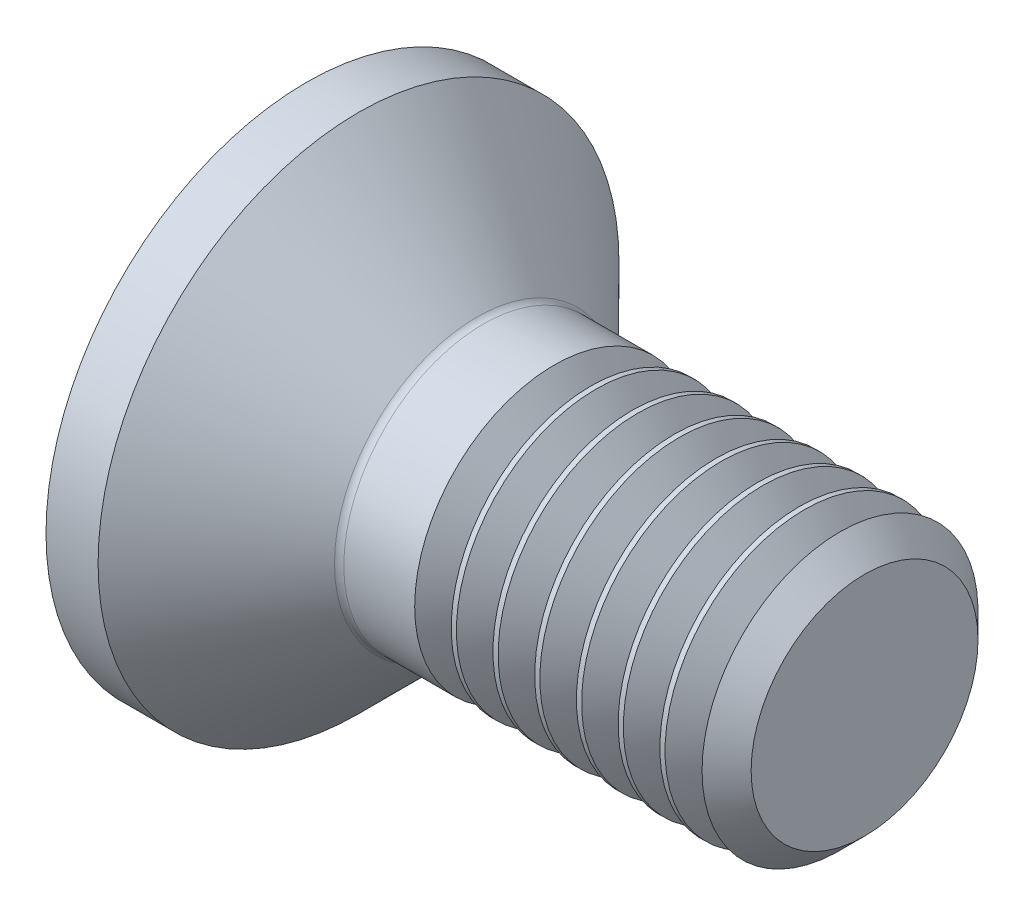
ISO-10303-21;
HEADER;
FILE_DESCRIPTION(('STEP AP214'),'2;1');
FILE_NAME('part.step','',(''),(''),'','','');
FILE_SCHEMA(('AUTOMOTIVE_DESIGN { 1 0 10303 214 1 1 1 1 }'));
ENDSEC;
DATA;
#1=APPLICATION_CONTEXT('core data for automotive mechanical design processes');
#2=APPLICATION_PROTOCOL_DEFINITION('international standard','automotive_design',2000,#1);
#3=PRODUCT_CONTEXT('',#1,'mechanical');
#4=PRODUCT('Part','Part','',(#3));
#5=PRODUCT_RELATED_PRODUCT_CATEGORY('part','',(#4));
#6=PRODUCT_DEFINITION_FORMATION('','',#4);
#7=PRODUCT_DEFINITION_CONTEXT('part definition',#1,'design');
#8=PRODUCT_DEFINITION('design','',#6,#7);
#9=PRODUCT_DEFINITION_SHAPE('','',#8);
#10=(LENGTH_UNIT() NAMED_UNIT(*) SI_UNIT(.MILLI.,.METRE.));
#11=(NAMED_UNIT(*) PLANE_ANGLE_UNIT() SI_UNIT($,.RADIAN.));
#12=(NAMED_UNIT(*) SI_UNIT($,.STERADIAN.) SOLID_ANGLE_UNIT());
#13=UNCERTAINTY_MEASURE_WITH_UNIT(LENGTH_MEASURE(1.E-05),#10,'distance_accuracy_value','');
#14=(GEOMETRIC_REPRESENTATION_CONTEXT(3) GLOBAL_UNCERTAINTY_ASSIGNED_CONTEXT((#13)) GLOBAL_UNIT_ASSIGNED_CONTEXT((#10,
#11,#12)) REPRESENTATION_CONTEXT('',''));
#15=CARTESIAN_POINT('',(0.,0.,0.));
#16=DIRECTION('',(0.,0.,1.));
#17=DIRECTION('',(1.,0.,0.));
#18=AXIS2_PLACEMENT_3D('',#15,#16,#17);
#19=CARTESIAN_POINT('',(0.,0.,0.));
#20=DIRECTION('',(-1.,0.,0.));
#21=DIRECTION('',(0.,0.,1.));
#22=AXIS2_PLACEMENT_3D('',#19,#20,#21);
#23=PLANE('',#22);
#24=CARTESIAN_POINT('',(0.,0.,0.));
#25=DIRECTION('',(-1.,0.,0.));
#26=DIRECTION('',(0.,0.,1.));
#27=AXIS2_PLACEMENT_3D('',#24,#25,#26);
#28=CIRCLE('',#27,2.8);
#29=CARTESIAN_POINT('',(0.,0.,2.8));
#30=VERTEX_POINT('',#29);
#31=EDGE_CURVE('E150',#30,#30,#28,.T.);
#32=ORIENTED_EDGE('',*,*,#31,.T.);
#33=EDGE_LOOP('',(#32));
#34=FACE_BOUND('',#33,.T.);
#35=DIRECTION('',(0.,-0.499999999999998,-0.86602540378444));
#36=VECTOR('',#35,1.);
#37=CARTESIAN_POINT('',(0.,-0.577350269189626,1.));
#38=LINE('',#37,#36);
#39=CARTESIAN_POINT('',(0.,-0.577350269189626,1.));
#40=VERTEX_POINT('',#39);
#41=CARTESIAN_POINT('',(0.,-1.15470053837925,0.));
#42=VERTEX_POINT('',#41);
#43=EDGE_CURVE('E119',#40,#42,#38,.T.);
#44=ORIENTED_EDGE('',*,*,#43,.T.);
#45=DIRECTION('',(0.,0.499999999999999,-0.866025403784439));
#46=VECTOR('',#45,1.);
#47=CARTESIAN_POINT('',(0.,-1.15470053837925,0.));
#48=LINE('',#47,#46);
#49=CARTESIAN_POINT('',(0.,-0.577350269189625,-1.));
#50=VERTEX_POINT('',#49);
#51=EDGE_CURVE('E50',#42,#50,#48,.T.);
#52=ORIENTED_EDGE('',*,*,#51,.T.);
#53=DIRECTION('',(0.,1.,0.));
#54=VECTOR('',#53,1.);
#55=CARTESIAN_POINT('',(0.,-0.577350269189625,-1.));
#56=LINE('',#55,#54);
#57=CARTESIAN_POINT('',(0.,0.577350269189626,-1.));
#58=VERTEX_POINT('',#57);
#59=EDGE_CURVE('E130',#50,#58,#56,.T.);
#60=ORIENTED_EDGE('',*,*,#59,.T.);
#61=DIRECTION('',(0.,0.5,0.866025403784439));
#62=VECTOR('',#61,1.);
#63=CARTESIAN_POINT('',(0.,0.577350269189626,-1.));
#64=LINE('',#63,#62);
#65=CARTESIAN_POINT('',(0.,1.15470053837925,0.));
#66=VERTEX_POINT('',#65);
#67=EDGE_CURVE('E361',#58,#66,#64,.T.);
#68=ORIENTED_EDGE('',*,*,#67,.T.);
#69=DIRECTION('',(0.,-0.499999999999999,0.866025403784439));
#70=VECTOR('',#69,1.);
#71=CARTESIAN_POINT('',(0.,1.15470053837925,0.));
#72=LINE('',#71,#70);
#73=CARTESIAN_POINT('',(0.,0.577350269189625,0.999999999999999));
#74=VERTEX_POINT('',#73);
#75=EDGE_CURVE('E364',#66,#74,#72,.T.);
#76=ORIENTED_EDGE('',*,*,#75,.T.);
#77=DIRECTION('',(0.,-1.,0.));
#78=VECTOR('',#77,1.);
#79=CARTESIAN_POINT('',(0.,0.577350269189625,0.999999999999999));
#80=LINE('',#79,#78);
#81=EDGE_CURVE('E367',#74,#40,#80,.T.);
#82=ORIENTED_EDGE('',*,*,#81,.T.);
#83=EDGE_LOOP('',(#44,#52,#60,#68,#76,#82));
#84=FACE_BOUND('',#83,.T.);
#85=ADVANCED_FACE('F34',(#34,#84),#23,.T.);
#86=CARTESIAN_POINT('',(0.,0.,0.));
#87=DIRECTION('',(-1.,0.,0.));
#88=DIRECTION('',(0.,0.,1.));
#89=AXIS2_PLACEMENT_3D('',#86,#87,#88);
#90=CYLINDRICAL_SURFACE('',#89,2.8);
#91=CARTESIAN_POINT('',(0.560000000000009,0.,0.));
#92=DIRECTION('',(-1.,0.,0.));
#93=DIRECTION('',(0.,0.,1.));
#94=AXIS2_PLACEMENT_3D('',#91,#92,#93);
#95=CIRCLE('',#94,2.8);
#96=CARTESIAN_POINT('',(0.560000000000009,0.,2.8));
#97=VERTEX_POINT('',#96);
#98=EDGE_CURVE('E147',#97,#97,#95,.T.);
#99=ORIENTED_EDGE('',*,*,#98,.T.);
#100=EDGE_LOOP('',(#99));
#101=FACE_BOUND('',#100,.T.);
#102=ORIENTED_EDGE('',*,*,#31,.F.);
#103=EDGE_LOOP('',(#102));
#104=FACE_BOUND('',#103,.T.);
#105=ADVANCED_FACE('F173',(#101,#104),#90,.T.);
#106=CARTESIAN_POINT('',(0.560000000000009,0.,0.));
#107=DIRECTION('',(-1.,0.,0.));
#108=DIRECTION('',(0.,0.,1.));
#109=AXIS2_PLACEMENT_3D('',#106,#107,#108);
#110=CONICAL_SURFACE('',#109,2.8,0.785398163397449);
#111=CARTESIAN_POINT('',(1.83071067811866,0.,0.));
#112=DIRECTION('',(-1.,0.,0.));
#113=DIRECTION('',(0.,0.,1.));
#114=AXIS2_PLACEMENT_3D('',#111,#112,#113);
#115=CIRCLE('',#114,1.52928932188135);
#116=CARTESIAN_POINT('',(1.83071067811866,0.,1.52928932188135));
#117=VERTEX_POINT('',#116);
#118=EDGE_CURVE('E43',#117,#117,#115,.T.);
#119=ORIENTED_EDGE('',*,*,#118,.T.);
#120=EDGE_LOOP('',(#119));
#121=FACE_BOUND('',#120,.T.);
#122=ORIENTED_EDGE('',*,*,#98,.F.);
#123=EDGE_LOOP('',(#122));
#124=FACE_BOUND('',#123,.T.);
#125=ADVANCED_FACE('F156',(#121,#124),#110,.T.);
#126=CARTESIAN_POINT('',(0.,0.,0.));
#127=DIRECTION('',(-1.,0.,0.));
#128=DIRECTION('',(0.,0.,1.));
#129=AXIS2_PLACEMENT_3D('',#126,#127,#128);
#130=CYLINDRICAL_SURFACE('',#129,1.5);
#131=CARTESIAN_POINT('',(2.66359278553218,0.,0.));
#132=DIRECTION('',(-1.,0.,0.));
#133=DIRECTION('',(0.,-1.,0.));
#134=AXIS2_PLACEMENT_3D('',#131,#132,#133);
#135=CIRCLE('',#134,1.5);
#136=CARTESIAN_POINT('',(2.66359278553218,-1.5,0.));
#137=VERTEX_POINT('',#136);
#138=EDGE_CURVE('E337',#137,#137,#135,.T.);
#139=ORIENTED_EDGE('',*,*,#138,.T.);
#140=EDGE_LOOP('',(#139));
#141=FACE_BOUND('',#140,.T.);
#142=CARTESIAN_POINT('',(1.90142135623731,0.,0.));
#143=DIRECTION('',(-1.,0.,0.));
#144=DIRECTION('',(0.,0.,1.));
#145=AXIS2_PLACEMENT_3D('',#142,#143,#144);
#146=CIRCLE('',#145,1.5);
#147=CARTESIAN_POINT('',(1.90142135623731,0.,1.5));
#148=VERTEX_POINT('',#147);
#149=EDGE_CURVE('E11',#148,#148,#146,.F.);
#150=ORIENTED_EDGE('',*,*,#149,.T.);
#151=EDGE_LOOP('',(#150));
#152=FACE_BOUND('',#151,.T.);
#153=ADVANCED_FACE('F160',(#141,#152),#130,.T.);
#154=CARTESIAN_POINT('',(1.90142135623731,0.,0.));
#155=DIRECTION('',(-1.,0.,0.));
#156=DIRECTION('',(0.,0.,1.));
#157=AXIS2_PLACEMENT_3D('',#154,#155,#156);
#158=TOROIDAL_SURFACE('',#157,1.6,0.1);
#159=ORIENTED_EDGE('',*,*,#149,.F.);
#160=EDGE_LOOP('',(#159));
#161=FACE_BOUND('',#160,.T.);
#162=ORIENTED_EDGE('',*,*,#118,.F.);
#163=EDGE_LOOP('',(#162));
#164=FACE_BOUND('',#163,.T.);
#165=ADVANCED_FACE('F36',(#161,#164),#158,.F.);
#166=CARTESIAN_POINT('',(1.1,-1.15470053837925,0.));
#167=DIRECTION('',(0.,0.866025403784439,0.499999999999999));
#168=DIRECTION('',(0.,-0.499999999999999,0.866025403784439));
#169=AXIS2_PLACEMENT_3D('',#166,#167,#168);
#170=PLANE('',#169);
#171=ORIENTED_EDGE('',*,*,#51,.F.);
#172=DIRECTION('',(-1.,0.,0.));
#173=VECTOR('',#172,1.);
#174=CARTESIAN_POINT('',(1.1,-1.15470053837925,0.));
#175=LINE('',#174,#173);
#176=CARTESIAN_POINT('',(1.1,-1.15470053837925,0.));
#177=VERTEX_POINT('',#176);
#178=EDGE_CURVE('E358',#177,#42,#175,.T.);
#179=ORIENTED_EDGE('',*,*,#178,.F.);
#180=DIRECTION('',(0.,0.499999999999999,-0.866025403784439));
#181=VECTOR('',#180,1.);
#182=CARTESIAN_POINT('',(1.1,-1.15470053837925,0.));
#183=LINE('',#182,#181);
#184=CARTESIAN_POINT('',(1.1,-0.866025403784438,-0.499999999999998));
#185=VERTEX_POINT('',#184);
#186=EDGE_CURVE('E115',#177,#185,#183,.T.);
#187=ORIENTED_EDGE('',*,*,#186,.T.);
#188=CARTESIAN_POINT('',(1.1,-0.577350269189625,-1.));
#189=VERTEX_POINT('',#188);
#190=EDGE_CURVE('E111',#185,#189,#183,.T.);
#191=ORIENTED_EDGE('',*,*,#190,.T.);
#192=DIRECTION('',(-1.,0.,0.));
#193=VECTOR('',#192,1.);
#194=CARTESIAN_POINT('',(1.1,-0.577350269189625,-1.));
#195=LINE('',#194,#193);
#196=EDGE_CURVE('E113',#189,#50,#195,.T.);
#197=ORIENTED_EDGE('',*,*,#196,.T.);
#198=EDGE_LOOP('',(#171,#179,#187,#191,#197));
#199=FACE_BOUND('',#198,.T.);
#200=ADVANCED_FACE('F112',(#199),#170,.T.);
#201=CARTESIAN_POINT('',(1.1,-0.577350269189625,-1.));
#202=DIRECTION('',(0.,0.,1.));
#203=DIRECTION('',(1.,0.,0.));
#204=AXIS2_PLACEMENT_3D('',#201,#202,#203);
#205=PLANE('',#204);
#206=ORIENTED_EDGE('',*,*,#59,.F.);
#207=ORIENTED_EDGE('',*,*,#196,.F.);
#208=DIRECTION('',(0.,1.,0.));
#209=VECTOR('',#208,1.);
#210=CARTESIAN_POINT('',(1.1,-0.577350269189625,-1.));
#211=LINE('',#210,#209);
#212=CARTESIAN_POINT('',(1.1,0.,-1.));
#213=VERTEX_POINT('',#212);
#214=EDGE_CURVE('E58',#189,#213,#211,.T.);
#215=ORIENTED_EDGE('',*,*,#214,.T.);
#216=CARTESIAN_POINT('',(1.1,0.577350269189626,-1.));
#217=VERTEX_POINT('',#216);
#218=EDGE_CURVE('E125',#213,#217,#211,.T.);
#219=ORIENTED_EDGE('',*,*,#218,.T.);
#220=DIRECTION('',(-1.,0.,0.));
#221=VECTOR('',#220,1.);
#222=CARTESIAN_POINT('',(1.1,0.577350269189626,-1.));
#223=LINE('',#222,#221);
#224=EDGE_CURVE('E132',#217,#58,#223,.T.);
#225=ORIENTED_EDGE('',*,*,#224,.T.);
#226=EDGE_LOOP('',(#206,#207,#215,#219,#225));
#227=FACE_BOUND('',#226,.T.);
#228=ADVANCED_FACE('F127',(#227),#205,.T.);
#229=CARTESIAN_POINT('',(1.1,0.577350269189626,-1.));
#230=DIRECTION('',(0.,-0.866025403784438,0.5));
#231=DIRECTION('',(0.,-0.5,-0.866025403784439));
#232=AXIS2_PLACEMENT_3D('',#229,#230,#231);
#233=PLANE('',#232);
#234=ORIENTED_EDGE('',*,*,#67,.F.);
#235=ORIENTED_EDGE('',*,*,#224,.F.);
#236=DIRECTION('',(0.,0.5,0.866025403784439));
#237=VECTOR('',#236,1.);
#238=CARTESIAN_POINT('',(1.1,0.577350269189626,-1.));
#239=LINE('',#238,#237);
#240=CARTESIAN_POINT('',(1.1,0.866025403784439,-0.5));
#241=VERTEX_POINT('',#240);
#242=EDGE_CURVE('E343',#217,#241,#239,.T.);
#243=ORIENTED_EDGE('',*,*,#242,.T.);
#244=CARTESIAN_POINT('',(1.1,1.15470053837925,0.));
#245=VERTEX_POINT('',#244);
#246=EDGE_CURVE('E124',#241,#245,#239,.T.);
#247=ORIENTED_EDGE('',*,*,#246,.T.);
#248=DIRECTION('',(-1.,0.,0.));
#249=VECTOR('',#248,1.);
#250=CARTESIAN_POINT('',(1.1,1.15470053837925,0.));
#251=LINE('',#250,#249);
#252=EDGE_CURVE('E138',#245,#66,#251,.T.);
#253=ORIENTED_EDGE('',*,*,#252,.T.);
#254=EDGE_LOOP('',(#234,#235,#243,#247,#253));
#255=FACE_BOUND('',#254,.T.);
#256=ADVANCED_FACE('F201',(#255),#233,.T.);
#257=CARTESIAN_POINT('',(1.1,1.15470053837925,0.));
#258=DIRECTION('',(0.,-0.866025403784439,-0.499999999999999));
#259=DIRECTION('',(0.,0.499999999999999,-0.866025403784439));
#260=AXIS2_PLACEMENT_3D('',#257,#258,#259);
#261=PLANE('',#260);
#262=ORIENTED_EDGE('',*,*,#75,.F.);
#263=ORIENTED_EDGE('',*,*,#252,.F.);
#264=DIRECTION('',(0.,-0.499999999999999,0.866025403784439));
#265=VECTOR('',#264,1.);
#266=CARTESIAN_POINT('',(1.1,1.15470053837925,0.));
#267=LINE('',#266,#265);
#268=CARTESIAN_POINT('',(1.1,0.866025403784438,0.499999999999999));
#269=VERTEX_POINT('',#268);
#270=EDGE_CURVE('E347',#245,#269,#267,.T.);
#271=ORIENTED_EDGE('',*,*,#270,.T.);
#272=CARTESIAN_POINT('',(1.1,0.577350269189625,0.999999999999999));
#273=VERTEX_POINT('',#272);
#274=EDGE_CURVE('E346',#269,#273,#267,.T.);
#275=ORIENTED_EDGE('',*,*,#274,.T.);
#276=DIRECTION('',(-1.,0.,0.));
#277=VECTOR('',#276,1.);
#278=CARTESIAN_POINT('',(1.1,0.577350269189625,0.999999999999999));
#279=LINE('',#278,#277);
#280=EDGE_CURVE('E376',#273,#74,#279,.T.);
#281=ORIENTED_EDGE('',*,*,#280,.T.);
#282=EDGE_LOOP('',(#262,#263,#271,#275,#281));
#283=FACE_BOUND('',#282,.T.);
#284=ADVANCED_FACE('F204',(#283),#261,.T.);
#285=CARTESIAN_POINT('',(1.1,0.577350269189625,0.999999999999999));
#286=DIRECTION('',(0.,0.,-1.));
#287=DIRECTION('',(0.,1.,0.));
#288=AXIS2_PLACEMENT_3D('',#285,#286,#287);
#289=PLANE('',#288);
#290=ORIENTED_EDGE('',*,*,#81,.F.);
#291=ORIENTED_EDGE('',*,*,#280,.F.);
#292=DIRECTION('',(0.,-1.,0.));
#293=VECTOR('',#292,1.);
#294=CARTESIAN_POINT('',(1.1,0.577350269189625,0.999999999999999));
#295=LINE('',#294,#293);
#296=CARTESIAN_POINT('',(1.1,0.,1.));
#297=VERTEX_POINT('',#296);
#298=EDGE_CURVE('E351',#273,#297,#295,.T.);
#299=ORIENTED_EDGE('',*,*,#298,.T.);
#300=CARTESIAN_POINT('',(1.1,-0.577350269189626,1.));
#301=VERTEX_POINT('',#300);
#302=EDGE_CURVE('E350',#297,#301,#295,.T.);
#303=ORIENTED_EDGE('',*,*,#302,.T.);
#304=DIRECTION('',(-1.,0.,0.));
#305=VECTOR('',#304,1.);
#306=CARTESIAN_POINT('',(1.1,-0.577350269189626,1.));
#307=LINE('',#306,#305);
#308=EDGE_CURVE('E373',#301,#40,#307,.T.);
#309=ORIENTED_EDGE('',*,*,#308,.T.);
#310=EDGE_LOOP('',(#290,#291,#299,#303,#309));
#311=FACE_BOUND('',#310,.T.);
#312=ADVANCED_FACE('F208',(#311),#289,.T.);
#313=CARTESIAN_POINT('',(1.1,-0.577350269189626,1.));
#314=DIRECTION('',(0.,0.86602540378444,-0.499999999999998));
#315=DIRECTION('',(0.,0.499999999999998,0.86602540378444));
#316=AXIS2_PLACEMENT_3D('',#313,#314,#315);
#317=PLANE('',#316);
#318=ORIENTED_EDGE('',*,*,#43,.F.);
#319=ORIENTED_EDGE('',*,*,#308,.F.);
#320=DIRECTION('',(0.,-0.499999999999998,-0.86602540378444));
#321=VECTOR('',#320,1.);
#322=CARTESIAN_POINT('',(1.1,-0.577350269189626,1.));
#323=LINE('',#322,#321);
#324=CARTESIAN_POINT('',(1.1,-0.866025403784439,0.499999999999997));
#325=VERTEX_POINT('',#324);
#326=EDGE_CURVE('E355',#301,#325,#323,.T.);
#327=ORIENTED_EDGE('',*,*,#326,.T.);
#328=EDGE_CURVE('E354',#325,#177,#323,.T.);
#329=ORIENTED_EDGE('',*,*,#328,.T.);
#330=ORIENTED_EDGE('',*,*,#178,.T.);
#331=EDGE_LOOP('',(#318,#319,#327,#329,#330));
#332=FACE_BOUND('',#331,.T.);
#333=ADVANCED_FACE('F212',(#332),#317,.T.);
#334=CARTESIAN_POINT('',(1.1,-0.577350269189626,-1.));
#335=DIRECTION('',(1.,0.,0.));
#336=DIRECTION('',(0.,0.,-1.));
#337=AXIS2_PLACEMENT_3D('',#334,#335,#336);
#338=PLANE('',#337);
#339=ORIENTED_EDGE('',*,*,#214,.F.);
#340=ORIENTED_EDGE('',*,*,#190,.F.);
#341=CARTESIAN_POINT('',(1.1,0.,0.));
#342=DIRECTION('',(-1.,0.,0.));
#343=DIRECTION('',(0.,0.,1.));
#344=AXIS2_PLACEMENT_3D('',#341,#342,#343);
#345=CIRCLE('',#344,1.);
#346=EDGE_CURVE('E122',#213,#185,#345,.T.);
#347=ORIENTED_EDGE('',*,*,#346,.F.);
#348=EDGE_LOOP('',(#339,#340,#347));
#349=FACE_BOUND('',#348,.T.);
#350=ADVANCED_FACE('F121',(#349),#338,.F.);
#351=ORIENTED_EDGE('',*,*,#186,.F.);
#352=ORIENTED_EDGE('',*,*,#328,.F.);
#353=EDGE_CURVE('E135',#185,#325,#345,.T.);
#354=ORIENTED_EDGE('',*,*,#353,.F.);
#355=EDGE_LOOP('',(#351,#352,#354));
#356=FACE_BOUND('',#355,.T.);
#357=ADVANCED_FACE('F219',(#356),#338,.F.);
#358=ORIENTED_EDGE('',*,*,#326,.F.);
#359=ORIENTED_EDGE('',*,*,#302,.F.);
#360=EDGE_CURVE('E131',#325,#297,#345,.T.);
#361=ORIENTED_EDGE('',*,*,#360,.F.);
#362=EDGE_LOOP('',(#358,#359,#361));
#363=FACE_BOUND('',#362,.T.);
#364=ADVANCED_FACE('F389',(#363),#338,.F.);
#365=ORIENTED_EDGE('',*,*,#298,.F.);
#366=ORIENTED_EDGE('',*,*,#274,.F.);
#367=EDGE_CURVE('E137',#297,#269,#345,.T.);
#368=ORIENTED_EDGE('',*,*,#367,.F.);
#369=EDGE_LOOP('',(#365,#366,#368));
#370=FACE_BOUND('',#369,.T.);
#371=ADVANCED_FACE('F400',(#370),#338,.F.);
#372=ORIENTED_EDGE('',*,*,#270,.F.);
#373=ORIENTED_EDGE('',*,*,#246,.F.);
#374=EDGE_CURVE('E144',#269,#241,#345,.T.);
#375=ORIENTED_EDGE('',*,*,#374,.F.);
#376=EDGE_LOOP('',(#372,#373,#375));
#377=FACE_BOUND('',#376,.T.);
#378=ADVANCED_FACE('F398',(#377),#338,.F.);
#379=ORIENTED_EDGE('',*,*,#242,.F.);
#380=ORIENTED_EDGE('',*,*,#218,.F.);
#381=EDGE_CURVE('E394',#241,#213,#345,.T.);
#382=ORIENTED_EDGE('',*,*,#381,.F.);
#383=EDGE_LOOP('',(#379,#380,#382));
#384=FACE_BOUND('',#383,.T.);
#385=ADVANCED_FACE('F196',(#384),#338,.F.);
#386=CARTESIAN_POINT('',(1.1,0.,0.));
#387=DIRECTION('',(-1.,0.,0.));
#388=DIRECTION('',(0.,0.,1.));
#389=AXIS2_PLACEMENT_3D('',#386,#387,#388);
#390=CONICAL_SURFACE('',#389,1.,1.04719755119659);
#391=CARTESIAN_POINT('',(1.67735026918963,0.,0.));
#392=VERTEX_POINT('',#391);
#393=VERTEX_LOOP('',#392);
#394=FACE_BOUND('',#393,.T.);
#395=ORIENTED_EDGE('',*,*,#367,.T.);
#396=ORIENTED_EDGE('',*,*,#374,.T.);
#397=ORIENTED_EDGE('',*,*,#381,.T.);
#398=ORIENTED_EDGE('',*,*,#346,.T.);
#399=ORIENTED_EDGE('',*,*,#353,.T.);
#400=ORIENTED_EDGE('',*,*,#360,.T.);
#401=EDGE_LOOP('',(#395,#396,#397,#398,#399,#400));
#402=FACE_BOUND('',#401,.T.);
#403=ADVANCED_FACE('F193',(#394,#402),#390,.F.);
#404=CARTESIAN_POINT('',(3.05640921446782,0.,0.));
#405=DIRECTION('',(1.,0.,0.));
#406=DIRECTION('',(0.,1.,0.));
#407=AXIS2_PLACEMENT_3D('',#404,#405,#406);
#408=CONICAL_SURFACE('',#407,1.5,0.959931088596885);
#409=CARTESIAN_POINT('',(2.860001,0.,0.));
#410=DIRECTION('',(-1.,0.,0.));
#411=DIRECTION('',(0.,-1.,0.));
#412=AXIS2_PLACEMENT_3D('',#409,#410,#411);
#413=CIRCLE('',#412,1.2195);
#414=CARTESIAN_POINT('',(2.860001,-1.2195,0.));
#415=VERTEX_POINT('',#414);
#416=EDGE_CURVE('E334',#415,#415,#413,.T.);
#417=ORIENTED_EDGE('',*,*,#416,.F.);
#418=EDGE_LOOP('',(#417));
#419=FACE_BOUND('',#418,.T.);
#420=CARTESIAN_POINT('',(3.05640921446782,0.,0.));
#421=DIRECTION('',(-1.,0.,0.));
#422=DIRECTION('',(0.,-1.,0.));
#423=AXIS2_PLACEMENT_3D('',#420,#421,#422);
#424=CIRCLE('',#423,1.5);
#425=CARTESIAN_POINT('',(3.05640921446782,-1.5,0.));
#426=VERTEX_POINT('',#425);
#427=EDGE_CURVE('E340',#426,#426,#424,.T.);
#428=ORIENTED_EDGE('',*,*,#427,.T.);
#429=EDGE_LOOP('',(#428));
#430=FACE_BOUND('',#429,.T.);
#431=ADVANCED_FACE('F195',(#419,#430),#408,.T.);
#432=CARTESIAN_POINT('',(2.860001,0.,0.));
#433=DIRECTION('',(-1.,0.,0.));
#434=DIRECTION('',(0.,-1.,0.));
#435=AXIS2_PLACEMENT_3D('',#432,#433,#434);
#436=CONICAL_SURFACE('',#435,1.2195,0.959931088596875);
#437=ORIENTED_EDGE('',*,*,#138,.F.);
#438=EDGE_LOOP('',(#437));
#439=FACE_BOUND('',#438,.T.);
#440=ORIENTED_EDGE('',*,*,#416,.T.);
#441=EDGE_LOOP('',(#440));
#442=FACE_BOUND('',#441,.T.);
#443=ADVANCED_FACE('F222',(#439,#442),#436,.T.);
#444=CARTESIAN_POINT('',(3.1121642141036,0.,0.));
#445=DIRECTION('',(-1.,0.,0.));
#446=DIRECTION('',(0.,-1.,0.));
#447=AXIS2_PLACEMENT_3D('',#444,#445,#446);
#448=CIRCLE('',#447,1.5);
#449=CARTESIAN_POINT('',(3.1121642141036,-1.5,0.));
#450=VERTEX_POINT('',#449);
#451=EDGE_CURVE('E328',#450,#450,#448,.T.);
#452=ORIENTED_EDGE('',*,*,#451,.T.);
#453=EDGE_LOOP('',(#452));
#454=FACE_BOUND('',#453,.T.);
#455=ORIENTED_EDGE('',*,*,#427,.F.);
#456=EDGE_LOOP('',(#455));
#457=FACE_BOUND('',#456,.T.);
#458=ADVANCED_FACE('F170',(#454,#457),#130,.T.);
#459=CARTESIAN_POINT('',(3.50498064303925,0.,0.));
#460=DIRECTION('',(1.,0.,0.));
#461=DIRECTION('',(0.,1.,0.));
#462=AXIS2_PLACEMENT_3D('',#459,#460,#461);
#463=CONICAL_SURFACE('',#462,1.5,0.959931088596885);
#464=CARTESIAN_POINT('',(3.30857242857143,0.,0.));
#465=DIRECTION('',(-1.,0.,0.));
#466=DIRECTION('',(0.,-1.,0.));
#467=AXIS2_PLACEMENT_3D('',#464,#465,#466);
#468=CIRCLE('',#467,1.2195);
#469=CARTESIAN_POINT('',(3.30857242857143,-1.2195,0.));
#470=VERTEX_POINT('',#469);
#471=EDGE_CURVE('E325',#470,#470,#468,.T.);
#472=ORIENTED_EDGE('',*,*,#471,.F.);
#473=EDGE_LOOP('',(#472));
#474=FACE_BOUND('',#473,.T.);
#475=CARTESIAN_POINT('',(3.50498064303925,0.,0.));
#476=DIRECTION('',(-1.,0.,0.));
#477=DIRECTION('',(0.,-1.,0.));
#478=AXIS2_PLACEMENT_3D('',#475,#476,#477);
#479=CIRCLE('',#478,1.5);
#480=CARTESIAN_POINT('',(3.50498064303925,-1.5,0.));
#481=VERTEX_POINT('',#480);
#482=EDGE_CURVE('E331',#481,#481,#479,.T.);
#483=ORIENTED_EDGE('',*,*,#482,.T.);
#484=EDGE_LOOP('',(#483));
#485=FACE_BOUND('',#484,.T.);
#486=ADVANCED_FACE('F227',(#474,#485),#463,.T.);
#487=CARTESIAN_POINT('',(3.30857242857143,0.,0.));
#488=DIRECTION('',(-1.,0.,0.));
#489=DIRECTION('',(0.,-1.,0.));
#490=AXIS2_PLACEMENT_3D('',#487,#488,#489);
#491=CONICAL_SURFACE('',#490,1.2195,0.959931088596875);
#492=ORIENTED_EDGE('',*,*,#451,.F.);
#493=EDGE_LOOP('',(#492));
#494=FACE_BOUND('',#493,.T.);
#495=ORIENTED_EDGE('',*,*,#471,.T.);
#496=EDGE_LOOP('',(#495));
#497=FACE_BOUND('',#496,.T.);
#498=ADVANCED_FACE('F230',(#494,#497),#491,.T.);
#499=CARTESIAN_POINT('',(3.56073564267503,0.,0.));
#500=DIRECTION('',(-1.,0.,0.));
#501=DIRECTION('',(0.,-1.,0.));
#502=AXIS2_PLACEMENT_3D('',#499,#500,#501);
#503=CIRCLE('',#502,1.5);
#504=CARTESIAN_POINT('',(3.56073564267503,-1.5,0.));
#505=VERTEX_POINT('',#504);
#506=EDGE_CURVE('E319',#505,#505,#503,.T.);
#507=ORIENTED_EDGE('',*,*,#506,.T.);
#508=EDGE_LOOP('',(#507));
#509=FACE_BOUND('',#508,.T.);
#510=ORIENTED_EDGE('',*,*,#482,.F.);
#511=EDGE_LOOP('',(#510));
#512=FACE_BOUND('',#511,.T.);
#513=ADVANCED_FACE('F234',(#509,#512),#130,.T.);
#514=CARTESIAN_POINT('',(3.95355207161068,0.,0.));
#515=DIRECTION('',(1.,0.,0.));
#516=DIRECTION('',(0.,1.,0.));
#517=AXIS2_PLACEMENT_3D('',#514,#515,#516);
#518=CONICAL_SURFACE('',#517,1.5,0.959931088596885);
#519=CARTESIAN_POINT('',(3.75714385714286,0.,0.));
#520=DIRECTION('',(-1.,0.,0.));
#521=DIRECTION('',(0.,-1.,0.));
#522=AXIS2_PLACEMENT_3D('',#519,#520,#521);
#523=CIRCLE('',#522,1.2195);
#524=CARTESIAN_POINT('',(3.75714385714286,-1.2195,0.));
#525=VERTEX_POINT('',#524);
#526=EDGE_CURVE('E316',#525,#525,#523,.T.);
#527=ORIENTED_EDGE('',*,*,#526,.F.);
#528=EDGE_LOOP('',(#527));
#529=FACE_BOUND('',#528,.T.);
#530=CARTESIAN_POINT('',(3.95355207161068,0.,0.));
#531=DIRECTION('',(-1.,0.,0.));
#532=DIRECTION('',(0.,-1.,0.));
#533=AXIS2_PLACEMENT_3D('',#530,#531,#532);
#534=CIRCLE('',#533,1.5);
#535=CARTESIAN_POINT('',(3.95355207161068,-1.5,0.));
#536=VERTEX_POINT('',#535);
#537=EDGE_CURVE('E322',#536,#536,#534,.T.);
#538=ORIENTED_EDGE('',*,*,#537,.T.);
#539=EDGE_LOOP('',(#538));
#540=FACE_BOUND('',#539,.T.);
#541=ADVANCED_FACE('F236',(#529,#540),#518,.T.);
#542=CARTESIAN_POINT('',(3.75714385714286,0.,0.));
#543=DIRECTION('',(-1.,0.,0.));
#544=DIRECTION('',(0.,-1.,0.));
#545=AXIS2_PLACEMENT_3D('',#542,#543,#544);
#546=CONICAL_SURFACE('',#545,1.2195,0.959931088596875);
#547=ORIENTED_EDGE('',*,*,#506,.F.);
#548=EDGE_LOOP('',(#547));
#549=FACE_BOUND('',#548,.T.);
#550=ORIENTED_EDGE('',*,*,#526,.T.);
#551=EDGE_LOOP('',(#550));
#552=FACE_BOUND('',#551,.T.);
#553=ADVANCED_FACE('F239',(#549,#552),#546,.T.);
#554=CARTESIAN_POINT('',(4.00930707124646,0.,0.));
#555=DIRECTION('',(-1.,0.,0.));
#556=DIRECTION('',(0.,-1.,0.));
#557=AXIS2_PLACEMENT_3D('',#554,#555,#556);
#558=CIRCLE('',#557,1.5);
#559=CARTESIAN_POINT('',(4.00930707124646,-1.5,0.));
#560=VERTEX_POINT('',#559);
#561=EDGE_CURVE('E310',#560,#560,#558,.T.);
#562=ORIENTED_EDGE('',*,*,#561,.T.);
#563=EDGE_LOOP('',(#562));
#564=FACE_BOUND('',#563,.T.);
#565=ORIENTED_EDGE('',*,*,#537,.F.);
#566=EDGE_LOOP('',(#565));
#567=FACE_BOUND('',#566,.T.);
#568=ADVANCED_FACE('F243',(#564,#567),#130,.T.);
#569=CARTESIAN_POINT('',(4.40212350018211,0.,0.));
#570=DIRECTION('',(1.,0.,0.));
#571=DIRECTION('',(0.,1.,0.));
#572=AXIS2_PLACEMENT_3D('',#569,#570,#571);
#573=CONICAL_SURFACE('',#572,1.5,0.959931088596885);
#574=CARTESIAN_POINT('',(4.20571528571429,0.,0.));
#575=DIRECTION('',(-1.,0.,0.));
#576=DIRECTION('',(0.,-1.,0.));
#577=AXIS2_PLACEMENT_3D('',#574,#575,#576);
#578=CIRCLE('',#577,1.2195);
#579=CARTESIAN_POINT('',(4.20571528571429,-1.2195,0.));
#580=VERTEX_POINT('',#579);
#581=EDGE_CURVE('E307',#580,#580,#578,.T.);
#582=ORIENTED_EDGE('',*,*,#581,.F.);
#583=EDGE_LOOP('',(#582));
#584=FACE_BOUND('',#583,.T.);
#585=CARTESIAN_POINT('',(4.40212350018211,0.,0.));
#586=DIRECTION('',(-1.,0.,0.));
#587=DIRECTION('',(0.,-1.,0.));
#588=AXIS2_PLACEMENT_3D('',#585,#586,#587);
#589=CIRCLE('',#588,1.5);
#590=CARTESIAN_POINT('',(4.40212350018211,-1.5,0.));
#591=VERTEX_POINT('',#590);
#592=EDGE_CURVE('E313',#591,#591,#589,.T.);
#593=ORIENTED_EDGE('',*,*,#592,.T.);
#594=EDGE_LOOP('',(#593));
#595=FACE_BOUND('',#594,.T.);
#596=ADVANCED_FACE('F245',(#584,#595),#573,.T.);
#597=CARTESIAN_POINT('',(4.20571528571429,0.,0.));
#598=DIRECTION('',(-1.,0.,0.));
#599=DIRECTION('',(0.,-1.,0.));
#600=AXIS2_PLACEMENT_3D('',#597,#598,#599);
#601=CONICAL_SURFACE('',#600,1.2195,0.959931088596875);
#602=ORIENTED_EDGE('',*,*,#561,.F.);
#603=EDGE_LOOP('',(#602));
#604=FACE_BOUND('',#603,.T.);
#605=ORIENTED_EDGE('',*,*,#581,.T.);
#606=EDGE_LOOP('',(#605));
#607=FACE_BOUND('',#606,.T.);
#608=ADVANCED_FACE('F248',(#604,#607),#601,.T.);
#609=CARTESIAN_POINT('',(4.45787849981789,0.,0.));
#610=DIRECTION('',(-1.,0.,0.));
#611=DIRECTION('',(0.,-1.,0.));
#612=AXIS2_PLACEMENT_3D('',#609,#610,#611);
#613=CIRCLE('',#612,1.5);
#614=CARTESIAN_POINT('',(4.45787849981789,-1.5,0.));
#615=VERTEX_POINT('',#614);
#616=EDGE_CURVE('E301',#615,#615,#613,.T.);
#617=ORIENTED_EDGE('',*,*,#616,.T.);
#618=EDGE_LOOP('',(#617));
#619=FACE_BOUND('',#618,.T.);
#620=ORIENTED_EDGE('',*,*,#592,.F.);
#621=EDGE_LOOP('',(#620));
#622=FACE_BOUND('',#621,.T.);
#623=ADVANCED_FACE('F252',(#619,#622),#130,.T.);
#624=CARTESIAN_POINT('',(4.85069492875354,0.,0.));
#625=DIRECTION('',(1.,0.,0.));
#626=DIRECTION('',(0.,1.,0.));
#627=AXIS2_PLACEMENT_3D('',#624,#625,#626);
#628=CONICAL_SURFACE('',#627,1.5,0.959931088596885);
#629=CARTESIAN_POINT('',(4.65428671428571,0.,0.));
#630=DIRECTION('',(-1.,0.,0.));
#631=DIRECTION('',(0.,-1.,0.));
#632=AXIS2_PLACEMENT_3D('',#629,#630,#631);
#633=CIRCLE('',#632,1.2195);
#634=CARTESIAN_POINT('',(4.65428671428571,-1.2195,0.));
#635=VERTEX_POINT('',#634);
#636=EDGE_CURVE('E298',#635,#635,#633,.T.);
#637=ORIENTED_EDGE('',*,*,#636,.F.);
#638=EDGE_LOOP('',(#637));
#639=FACE_BOUND('',#638,.T.);
#640=CARTESIAN_POINT('',(4.85069492875354,0.,0.));
#641=DIRECTION('',(-1.,0.,0.));
#642=DIRECTION('',(0.,-1.,0.));
#643=AXIS2_PLACEMENT_3D('',#640,#641,#642);
#644=CIRCLE('',#643,1.5);
#645=CARTESIAN_POINT('',(4.85069492875354,-1.5,0.));
#646=VERTEX_POINT('',#645);
#647=EDGE_CURVE('E304',#646,#646,#644,.T.);
#648=ORIENTED_EDGE('',*,*,#647,.T.);
#649=EDGE_LOOP('',(#648));
#650=FACE_BOUND('',#649,.T.);
#651=ADVANCED_FACE('F254',(#639,#650),#628,.T.);
#652=CARTESIAN_POINT('',(4.65428671428571,0.,0.));
#653=DIRECTION('',(-1.,0.,0.));
#654=DIRECTION('',(0.,-1.,0.));
#655=AXIS2_PLACEMENT_3D('',#652,#653,#654);
#656=CONICAL_SURFACE('',#655,1.2195,0.959931088596875);
#657=ORIENTED_EDGE('',*,*,#616,.F.);
#658=EDGE_LOOP('',(#657));
#659=FACE_BOUND('',#658,.T.);
#660=ORIENTED_EDGE('',*,*,#636,.T.);
#661=EDGE_LOOP('',(#660));
#662=FACE_BOUND('',#661,.T.);
#663=ADVANCED_FACE('F257',(#659,#662),#656,.T.);
#664=CARTESIAN_POINT('',(4.90644992838932,0.,0.));
#665=DIRECTION('',(-1.,0.,0.));
#666=DIRECTION('',(0.,-1.,0.));
#667=AXIS2_PLACEMENT_3D('',#664,#665,#666);
#668=CIRCLE('',#667,1.5);
#669=CARTESIAN_POINT('',(4.90644992838932,-1.5,0.));
#670=VERTEX_POINT('',#669);
#671=EDGE_CURVE('E292',#670,#670,#668,.T.);
#672=ORIENTED_EDGE('',*,*,#671,.T.);
#673=EDGE_LOOP('',(#672));
#674=FACE_BOUND('',#673,.T.);
#675=ORIENTED_EDGE('',*,*,#647,.F.);
#676=EDGE_LOOP('',(#675));
#677=FACE_BOUND('',#676,.T.);
#678=ADVANCED_FACE('F261',(#674,#677),#130,.T.);
#679=CARTESIAN_POINT('',(5.29926635732496,0.,0.));
#680=DIRECTION('',(1.,0.,0.));
#681=DIRECTION('',(0.,1.,0.));
#682=AXIS2_PLACEMENT_3D('',#679,#680,#681);
#683=CONICAL_SURFACE('',#682,1.5,0.959931088596885);
#684=CARTESIAN_POINT('',(5.10285814285714,0.,0.));
#685=DIRECTION('',(-1.,0.,0.));
#686=DIRECTION('',(0.,-1.,0.));
#687=AXIS2_PLACEMENT_3D('',#684,#685,#686);
#688=CIRCLE('',#687,1.2195);
#689=CARTESIAN_POINT('',(5.10285814285714,-1.2195,0.));
#690=VERTEX_POINT('',#689);
#691=EDGE_CURVE('E289',#690,#690,#688,.T.);
#692=ORIENTED_EDGE('',*,*,#691,.F.);
#693=EDGE_LOOP('',(#692));
#694=FACE_BOUND('',#693,.T.);
#695=CARTESIAN_POINT('',(5.29926635732496,0.,0.));
#696=DIRECTION('',(-1.,0.,0.));
#697=DIRECTION('',(0.,-1.,0.));
#698=AXIS2_PLACEMENT_3D('',#695,#696,#697);
#699=CIRCLE('',#698,1.5);
#700=CARTESIAN_POINT('',(5.29926635732496,-1.5,0.));
#701=VERTEX_POINT('',#700);
#702=EDGE_CURVE('E295',#701,#701,#699,.T.);
#703=ORIENTED_EDGE('',*,*,#702,.T.);
#704=EDGE_LOOP('',(#703));
#705=FACE_BOUND('',#704,.T.);
#706=ADVANCED_FACE('F263',(#694,#705),#683,.T.);
#707=CARTESIAN_POINT('',(5.10285814285714,0.,0.));
#708=DIRECTION('',(-1.,0.,0.));
#709=DIRECTION('',(0.,-1.,0.));
#710=AXIS2_PLACEMENT_3D('',#707,#708,#709);
#711=CONICAL_SURFACE('',#710,1.2195,0.959931088596875);
#712=ORIENTED_EDGE('',*,*,#671,.F.);
#713=EDGE_LOOP('',(#712));
#714=FACE_BOUND('',#713,.T.);
#715=ORIENTED_EDGE('',*,*,#691,.T.);
#716=EDGE_LOOP('',(#715));
#717=FACE_BOUND('',#716,.T.);
#718=ADVANCED_FACE('F266',(#714,#717),#711,.T.);
#719=CARTESIAN_POINT('',(5.35502135696075,0.,0.));
#720=DIRECTION('',(-1.,0.,0.));
#721=DIRECTION('',(0.,-1.,0.));
#722=AXIS2_PLACEMENT_3D('',#719,#720,#721);
#723=CIRCLE('',#722,1.5);
#724=CARTESIAN_POINT('',(5.35502135696075,-1.5,0.));
#725=VERTEX_POINT('',#724);
#726=EDGE_CURVE('E282',#725,#725,#723,.T.);
#727=ORIENTED_EDGE('',*,*,#726,.T.);
#728=EDGE_LOOP('',(#727));
#729=FACE_BOUND('',#728,.T.);
#730=ORIENTED_EDGE('',*,*,#702,.F.);
#731=EDGE_LOOP('',(#730));
#732=FACE_BOUND('',#731,.T.);
#733=ADVANCED_FACE('F169',(#729,#732),#130,.T.);
#734=CARTESIAN_POINT('',(5.74783778589639,0.,0.));
#735=DIRECTION('',(1.,0.,0.));
#736=DIRECTION('',(0.,1.,0.));
#737=AXIS2_PLACEMENT_3D('',#734,#735,#736);
#738=CONICAL_SURFACE('',#737,1.5,0.959931088596885);
#739=CARTESIAN_POINT('',(5.55142957142857,0.,0.));
#740=DIRECTION('',(-1.,0.,0.));
#741=DIRECTION('',(0.,-1.,0.));
#742=AXIS2_PLACEMENT_3D('',#739,#740,#741);
#743=CIRCLE('',#742,1.2195);
#744=CARTESIAN_POINT('',(5.55142957142857,-1.2195,0.));
#745=VERTEX_POINT('',#744);
#746=EDGE_CURVE('E285',#745,#745,#743,.T.);
#747=ORIENTED_EDGE('',*,*,#746,.F.);
#748=EDGE_LOOP('',(#747));
#749=FACE_BOUND('',#748,.T.);
#750=CARTESIAN_POINT('',(5.73616725106173,0.,0.));
#751=DIRECTION('',(1.,0.,0.));
#752=DIRECTION('',(0.,1.,0.));
#753=AXIS2_PLACEMENT_3D('',#750,#751,#752);
#754=CIRCLE('',#753,1.48333274893827);
#755=CARTESIAN_POINT('',(5.73616725106173,1.48333274893827,0.));
#756=VERTEX_POINT('',#755);
#757=EDGE_CURVE('E38',#756,#756,#754,.T.);
#758=ORIENTED_EDGE('',*,*,#757,.F.);
#759=EDGE_LOOP('',(#758));
#760=FACE_BOUND('',#759,.T.);
#761=ADVANCED_FACE('F271',(#749,#760),#738,.T.);
#762=CARTESIAN_POINT('',(5.55142957142857,0.,0.));
#763=DIRECTION('',(-1.,0.,0.));
#764=DIRECTION('',(0.,-1.,0.));
#765=AXIS2_PLACEMENT_3D('',#762,#763,#764);
#766=CONICAL_SURFACE('',#765,1.2195,0.959931088596875);
#767=ORIENTED_EDGE('',*,*,#726,.F.);
#768=EDGE_LOOP('',(#767));
#769=FACE_BOUND('',#768,.T.);
#770=ORIENTED_EDGE('',*,*,#746,.T.);
#771=EDGE_LOOP('',(#770));
#772=FACE_BOUND('',#771,.T.);
#773=ADVANCED_FACE('F191',(#769,#772),#766,.T.);
#774=CARTESIAN_POINT('',(6.00000000000001,1.2195,0.));
#775=DIRECTION('',(1.,0.,0.));
#776=DIRECTION('',(0.,0.,-1.));
#777=AXIS2_PLACEMENT_3D('',#774,#775,#776);
#778=PLANE('',#777);
#779=CARTESIAN_POINT('',(6.00000000000001,0.,0.));
#780=DIRECTION('',(-1.,0.,0.));
#781=DIRECTION('',(0.,0.,1.));
#782=AXIS2_PLACEMENT_3D('',#779,#780,#781);
#783=CIRCLE('',#782,1.2195);
#784=CARTESIAN_POINT('',(6.00000000000001,0.,1.2195));
#785=VERTEX_POINT('',#784);
#786=EDGE_CURVE('E143',#785,#785,#783,.T.);
#787=ORIENTED_EDGE('',*,*,#786,.F.);
#788=EDGE_LOOP('',(#787));
#789=FACE_BOUND('',#788,.T.);
#790=ADVANCED_FACE('F187',(#789),#778,.T.);
#791=CARTESIAN_POINT('',(6.00000000000001,0.,0.));
#792=DIRECTION('',(-1.,0.,0.));
#793=DIRECTION('',(0.,0.,1.));
#794=AXIS2_PLACEMENT_3D('',#791,#792,#793);
#795=CONICAL_SURFACE('',#794,1.2195,0.785398163397448);
#796=ORIENTED_EDGE('',*,*,#757,.T.);
#797=EDGE_LOOP('',(#796));
#798=FACE_BOUND('',#797,.T.);
#799=ORIENTED_EDGE('',*,*,#786,.T.);
#800=EDGE_LOOP('',(#799));
#801=FACE_BOUND('',#800,.T.);
#802=ADVANCED_FACE('F184',(#798,#801),#795,.T.);
#803=CLOSED_SHELL('',(#85,#105,#125,#153,#165,#200,#228,#256,#284,#312,#333,#350,#357,#364,#371,
#378,#385,#403,#431,#443,#458,#486,#498,#513,#541,#553,#568,#596,#608,#623,#651,#663,#678,#706,
#718,#733,#761,#773,#790,#802));
#804=MANIFOLD_SOLID_BREP('B2',#803);
#805=ADVANCED_BREP_SHAPE_REPRESENTATION('',(#18,#804),#14);
#806=SHAPE_DEFINITION_REPRESENTATION(#9,#805);
ENDSEC;
END-ISO-10303-21;
